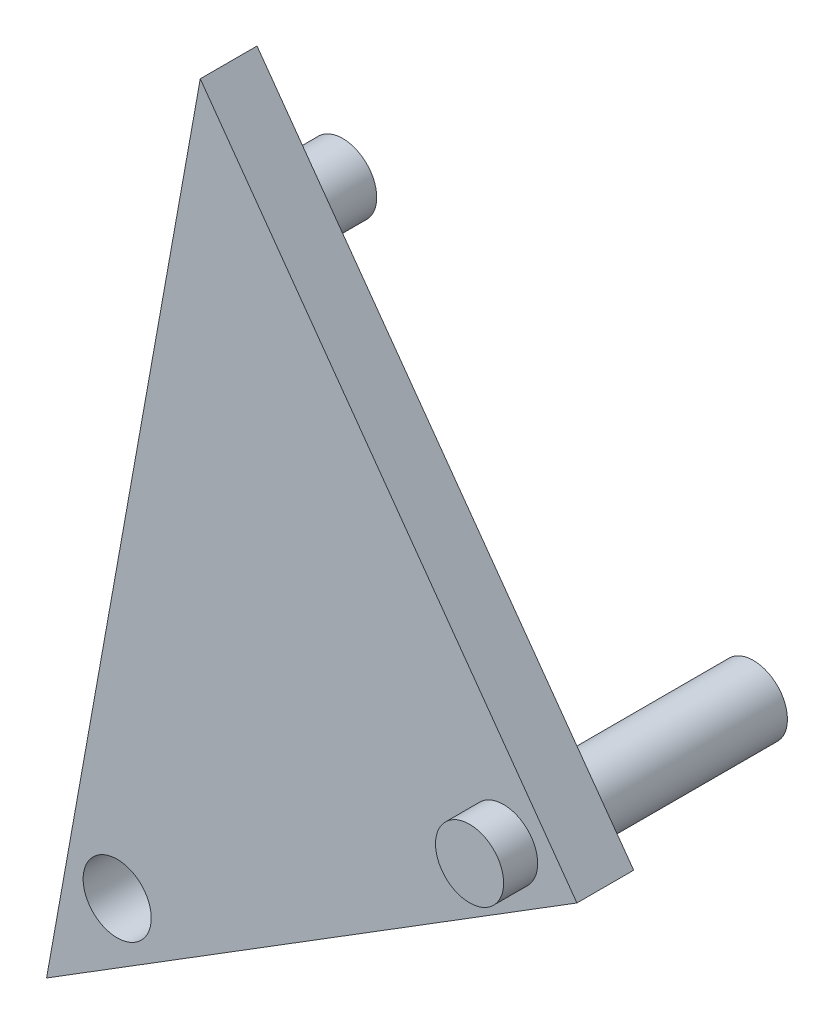
ISO-10303-21;
HEADER;
FILE_DESCRIPTION(('STEP AP214'),'2;1');
FILE_NAME('part.step','',(''),(''),'','','');
FILE_SCHEMA(('AUTOMOTIVE_DESIGN { 1 0 10303 214 1 1 1 1 }'));
ENDSEC;
DATA;
#1=APPLICATION_CONTEXT('core data for automotive mechanical design processes');
#2=APPLICATION_PROTOCOL_DEFINITION('international standard','automotive_design',2000,#1);
#3=PRODUCT_CONTEXT('',#1,'mechanical');
#4=PRODUCT('Part','Part','',(#3));
#5=PRODUCT_RELATED_PRODUCT_CATEGORY('part','',(#4));
#6=PRODUCT_DEFINITION_FORMATION('','',#4);
#7=PRODUCT_DEFINITION_CONTEXT('part definition',#1,'design');
#8=PRODUCT_DEFINITION('design','',#6,#7);
#9=PRODUCT_DEFINITION_SHAPE('','',#8);
#10=(LENGTH_UNIT() NAMED_UNIT(*) SI_UNIT(.MILLI.,.METRE.));
#11=(NAMED_UNIT(*) PLANE_ANGLE_UNIT() SI_UNIT($,.RADIAN.));
#12=(NAMED_UNIT(*) SI_UNIT($,.STERADIAN.) SOLID_ANGLE_UNIT());
#13=UNCERTAINTY_MEASURE_WITH_UNIT(LENGTH_MEASURE(1.E-05),#10,'distance_accuracy_value','');
#14=(GEOMETRIC_REPRESENTATION_CONTEXT(3) GLOBAL_UNCERTAINTY_ASSIGNED_CONTEXT((#13)) GLOBAL_UNIT_ASSIGNED_CONTEXT((#10,
#11,#12)) REPRESENTATION_CONTEXT('',''));
#15=CARTESIAN_POINT('',(0.,0.,0.));
#16=DIRECTION('',(0.,0.,1.));
#17=DIRECTION('',(1.,0.,0.));
#18=AXIS2_PLACEMENT_3D('',#15,#16,#17);
#19=CARTESIAN_POINT('',(0.,0.,5.));
#20=DIRECTION('',(0.,0.,-1.));
#21=DIRECTION('',(-1.,0.,0.));
#22=AXIS2_PLACEMENT_3D('',#19,#20,#21);
#23=PLANE('',#22);
#24=CARTESIAN_POINT('',(0.,0.,5.));
#25=DIRECTION('',(0.,0.,-1.));
#26=DIRECTION('',(-1.,0.,0.));
#27=AXIS2_PLACEMENT_3D('',#24,#25,#26);
#28=CIRCLE('',#27,3.);
#29=CARTESIAN_POINT('',(-3.,0.,5.));
#30=VERTEX_POINT('',#29);
#31=EDGE_CURVE('E11',#30,#30,#28,.F.);
#32=ORIENTED_EDGE('',*,*,#31,.F.);
#33=EDGE_LOOP('',(#32));
#34=FACE_BOUND('',#33,.T.);
#35=DIRECTION('',(-0.582602056564009,0.812757555293943,0.));
#36=VECTOR('',#35,1.);
#37=CARTESIAN_POINT('',(6.45568328839875,-1.28201635887784,5.));
#38=LINE('',#37,#36);
#39=CARTESIAN_POINT('',(6.45568328839875,-1.28201635887784,5.));
#40=VERTEX_POINT('',#39);
#41=CARTESIAN_POINT('',(-26.7245022929149,45.0059193142518,5.));
#42=VERTEX_POINT('',#41);
#43=EDGE_CURVE('E75',#40,#42,#38,.T.);
#44=ORIENTED_EDGE('',*,*,#43,.T.);
#45=DIRECTION('',(-0.176792332926242,-0.984248175522056,0.));
#46=VECTOR('',#45,1.);
#47=CARTESIAN_POINT('',(-26.7245022929149,45.0059193142518,5.));
#48=LINE('',#47,#46);
#49=CARTESIAN_POINT('',(-40.2625589217451,-30.3639076261477,5.));
#50=VERTEX_POINT('',#49);
#51=EDGE_CURVE('E70',#42,#50,#48,.T.);
#52=ORIENTED_EDGE('',*,*,#51,.T.);
#53=DIRECTION('',(0.848952556725454,0.528469068564391,0.));
#54=VECTOR('',#53,1.);
#55=CARTESIAN_POINT('',(-40.2625589217451,-30.3639076261477,5.));
#56=LINE('',#55,#54);
#57=EDGE_CURVE('E49',#50,#40,#56,.T.);
#58=ORIENTED_EDGE('',*,*,#57,.T.);
#59=EDGE_LOOP('',(#44,#52,#58));
#60=FACE_BOUND('',#59,.T.);
#61=CARTESIAN_POINT('',(-34.0429975246907,-21.1916096494321,5.));
#62=DIRECTION('',(0.,0.,1.));
#63=DIRECTION('',(1.,0.,0.));
#64=AXIS2_PLACEMENT_3D('',#61,#62,#63);
#65=CIRCLE('',#64,3.);
#66=CARTESIAN_POINT('',(-31.0429975246907,-21.1916096494321,5.));
#67=VERTEX_POINT('',#66);
#68=EDGE_CURVE('E90',#67,#67,#65,.T.);
#69=ORIENTED_EDGE('',*,*,#68,.F.);
#70=EDGE_LOOP('',(#69));
#71=FACE_BOUND('',#70,.T.);
#72=ADVANCED_FACE('F32',(#34,#60,#71),#23,.F.);
#73=CARTESIAN_POINT('',(0.,0.,0.));
#74=DIRECTION('',(0.,0.,-1.));
#75=DIRECTION('',(-1.,0.,0.));
#76=AXIS2_PLACEMENT_3D('',#73,#74,#75);
#77=PLANE('',#76);
#78=CARTESIAN_POINT('',(0.,0.,0.));
#79=DIRECTION('',(0.,0.,-1.));
#80=DIRECTION('',(-1.,0.,0.));
#81=AXIS2_PLACEMENT_3D('',#78,#79,#80);
#82=CIRCLE('',#81,3.);
#83=CARTESIAN_POINT('',(-3.,0.,0.));
#84=VERTEX_POINT('',#83);
#85=EDGE_CURVE('E103',#84,#84,#82,.T.);
#86=ORIENTED_EDGE('',*,*,#85,.F.);
#87=EDGE_LOOP('',(#86));
#88=FACE_BOUND('',#87,.T.);
#89=DIRECTION('',(-0.582602056564009,0.812757555293943,0.));
#90=VECTOR('',#89,1.);
#91=CARTESIAN_POINT('',(6.45568328839875,-1.28201635887784,0.));
#92=LINE('',#91,#90);
#93=CARTESIAN_POINT('',(6.45568328839875,-1.28201635887784,0.));
#94=VERTEX_POINT('',#93);
#95=CARTESIAN_POINT('',(-26.7245022929149,45.0059193142518,0.));
#96=VERTEX_POINT('',#95);
#97=EDGE_CURVE('E82',#94,#96,#92,.T.);
#98=ORIENTED_EDGE('',*,*,#97,.F.);
#99=DIRECTION('',(0.848952556725454,0.528469068564391,0.));
#100=VECTOR('',#99,1.);
#101=CARTESIAN_POINT('',(-40.2625589217451,-30.3639076261477,0.));
#102=LINE('',#101,#100);
#103=CARTESIAN_POINT('',(-40.2625589217451,-30.3639076261477,0.));
#104=VERTEX_POINT('',#103);
#105=EDGE_CURVE('E67',#104,#94,#102,.T.);
#106=ORIENTED_EDGE('',*,*,#105,.F.);
#107=DIRECTION('',(-0.176792332926242,-0.984248175522056,0.));
#108=VECTOR('',#107,1.);
#109=CARTESIAN_POINT('',(-26.7245022929149,45.0059193142518,0.));
#110=LINE('',#109,#108);
#111=EDGE_CURVE('E62',#96,#104,#110,.T.);
#112=ORIENTED_EDGE('',*,*,#111,.F.);
#113=EDGE_LOOP('',(#98,#106,#112));
#114=FACE_BOUND('',#113,.T.);
#115=CARTESIAN_POINT('',(-24.1779853474064,33.7294385446986,0.));
#116=DIRECTION('',(0.,0.,-1.));
#117=DIRECTION('',(-1.,0.,0.));
#118=AXIS2_PLACEMENT_3D('',#115,#116,#117);
#119=CIRCLE('',#118,3.);
#120=CARTESIAN_POINT('',(-27.1779853474064,33.7294385446986,0.));
#121=VERTEX_POINT('',#120);
#122=EDGE_CURVE('E95',#121,#121,#119,.T.);
#123=ORIENTED_EDGE('',*,*,#122,.F.);
#124=EDGE_LOOP('',(#123));
#125=FACE_BOUND('',#124,.T.);
#126=CARTESIAN_POINT('',(-34.0429975246907,-21.1916096494321,0.));
#127=DIRECTION('',(0.,0.,1.));
#128=DIRECTION('',(1.,0.,0.));
#129=AXIS2_PLACEMENT_3D('',#126,#127,#128);
#130=CIRCLE('',#129,3.);
#131=CARTESIAN_POINT('',(-31.0429975246907,-21.1916096494321,0.));
#132=VERTEX_POINT('',#131);
#133=EDGE_CURVE('E92',#132,#132,#130,.T.);
#134=ORIENTED_EDGE('',*,*,#133,.T.);
#135=EDGE_LOOP('',(#134));
#136=FACE_BOUND('',#135,.T.);
#137=ADVANCED_FACE('F123',(#88,#114,#125,#136),#77,.T.);
#138=CARTESIAN_POINT('',(6.45568328839875,-1.28201635887784,5.));
#139=DIRECTION('',(-0.812757555293943,-0.582602056564009,0.));
#140=DIRECTION('',(0.582602056564009,-0.812757555293943,0.));
#141=AXIS2_PLACEMENT_3D('',#138,#139,#140);
#142=PLANE('',#141);
#143=ORIENTED_EDGE('',*,*,#97,.T.);
#144=DIRECTION('',(0.,0.,-1.));
#145=VECTOR('',#144,1.);
#146=CARTESIAN_POINT('',(-26.7245022929149,45.0059193142518,5.));
#147=LINE('',#146,#145);
#148=EDGE_CURVE('E41',#42,#96,#147,.T.);
#149=ORIENTED_EDGE('',*,*,#148,.F.);
#150=ORIENTED_EDGE('',*,*,#43,.F.);
#151=DIRECTION('',(0.,0.,-1.));
#152=VECTOR('',#151,1.);
#153=CARTESIAN_POINT('',(6.45568328839875,-1.28201635887784,5.));
#154=LINE('',#153,#152);
#155=EDGE_CURVE('E83',#40,#94,#154,.T.);
#156=ORIENTED_EDGE('',*,*,#155,.T.);
#157=EDGE_LOOP('',(#143,#149,#150,#156));
#158=FACE_BOUND('',#157,.T.);
#159=ADVANCED_FACE('F34',(#158),#142,.F.);
#160=CARTESIAN_POINT('',(-26.7245022929149,45.0059193142518,5.));
#161=DIRECTION('',(0.984248175522056,-0.176792332926242,0.));
#162=DIRECTION('',(0.176792332926242,0.984248175522056,0.));
#163=AXIS2_PLACEMENT_3D('',#160,#161,#162);
#164=PLANE('',#163);
#165=ORIENTED_EDGE('',*,*,#111,.T.);
#166=DIRECTION('',(0.,0.,-1.));
#167=VECTOR('',#166,1.);
#168=CARTESIAN_POINT('',(-40.2625589217451,-30.3639076261477,5.));
#169=LINE('',#168,#167);
#170=EDGE_CURVE('E74',#50,#104,#169,.T.);
#171=ORIENTED_EDGE('',*,*,#170,.F.);
#172=ORIENTED_EDGE('',*,*,#51,.F.);
#173=ORIENTED_EDGE('',*,*,#148,.T.);
#174=EDGE_LOOP('',(#165,#171,#172,#173));
#175=FACE_BOUND('',#174,.T.);
#176=ADVANCED_FACE('F71',(#175),#164,.F.);
#177=CARTESIAN_POINT('',(-40.2625589217451,-30.3639076261477,5.));
#178=DIRECTION('',(-0.528469068564391,0.848952556725454,0.));
#179=DIRECTION('',(-0.848952556725454,-0.528469068564391,0.));
#180=AXIS2_PLACEMENT_3D('',#177,#178,#179);
#181=PLANE('',#180);
#182=ORIENTED_EDGE('',*,*,#105,.T.);
#183=ORIENTED_EDGE('',*,*,#155,.F.);
#184=ORIENTED_EDGE('',*,*,#57,.F.);
#185=ORIENTED_EDGE('',*,*,#170,.T.);
#186=EDGE_LOOP('',(#182,#183,#184,#185));
#187=FACE_BOUND('',#186,.T.);
#188=ADVANCED_FACE('F134',(#187),#181,.F.);
#189=CARTESIAN_POINT('',(-34.0429975246907,-21.1916096494321,5.));
#190=DIRECTION('',(0.,0.,-1.));
#191=DIRECTION('',(-1.,0.,0.));
#192=AXIS2_PLACEMENT_3D('',#189,#190,#191);
#193=CYLINDRICAL_SURFACE('',#192,3.);
#194=ORIENTED_EDGE('',*,*,#68,.T.);
#195=EDGE_LOOP('',(#194));
#196=FACE_BOUND('',#195,.T.);
#197=ORIENTED_EDGE('',*,*,#133,.F.);
#198=EDGE_LOOP('',(#197));
#199=FACE_BOUND('',#198,.T.);
#200=ADVANCED_FACE('F131',(#196,#199),#193,.F.);
#201=CARTESIAN_POINT('',(-24.1779853474064,33.7294385446986,-5.));
#202=DIRECTION('',(0.,0.,1.));
#203=DIRECTION('',(1.,0.,0.));
#204=AXIS2_PLACEMENT_3D('',#201,#202,#203);
#205=CYLINDRICAL_SURFACE('',#204,3.);
#206=ORIENTED_EDGE('',*,*,#122,.T.);
#207=EDGE_LOOP('',(#206));
#208=FACE_BOUND('',#207,.T.);
#209=CARTESIAN_POINT('',(-24.1779853474064,33.7294385446986,-5.));
#210=DIRECTION('',(0.,0.,1.));
#211=DIRECTION('',(1.,0.,0.));
#212=AXIS2_PLACEMENT_3D('',#209,#210,#211);
#213=CIRCLE('',#212,3.);
#214=CARTESIAN_POINT('',(-21.1779853474064,33.7294385446986,-5.));
#215=VERTEX_POINT('',#214);
#216=EDGE_CURVE('E100',#215,#215,#213,.T.);
#217=ORIENTED_EDGE('',*,*,#216,.T.);
#218=EDGE_LOOP('',(#217));
#219=FACE_BOUND('',#218,.T.);
#220=ADVANCED_FACE('F170',(#208,#219),#205,.T.);
#221=CARTESIAN_POINT('',(-24.1779853474064,33.7294385446986,-5.));
#222=DIRECTION('',(0.,0.,1.));
#223=DIRECTION('',(1.,0.,0.));
#224=AXIS2_PLACEMENT_3D('',#221,#222,#223);
#225=PLANE('',#224);
#226=ORIENTED_EDGE('',*,*,#216,.F.);
#227=EDGE_LOOP('',(#226));
#228=FACE_BOUND('',#227,.T.);
#229=ADVANCED_FACE('F185',(#228),#225,.F.);
#230=CARTESIAN_POINT('',(0.,0.,-17.));
#231=DIRECTION('',(0.,0.,1.));
#232=DIRECTION('',(1.,0.,0.));
#233=AXIS2_PLACEMENT_3D('',#230,#231,#232);
#234=CYLINDRICAL_SURFACE('',#233,3.);
#235=ORIENTED_EDGE('',*,*,#85,.T.);
#236=EDGE_LOOP('',(#235));
#237=FACE_BOUND('',#236,.T.);
#238=CARTESIAN_POINT('',(0.,0.,-17.));
#239=DIRECTION('',(0.,0.,1.));
#240=DIRECTION('',(1.,0.,0.));
#241=AXIS2_PLACEMENT_3D('',#238,#239,#240);
#242=CIRCLE('',#241,3.);
#243=CARTESIAN_POINT('',(3.,0.,-17.));
#244=VERTEX_POINT('',#243);
#245=EDGE_CURVE('E106',#244,#244,#242,.T.);
#246=ORIENTED_EDGE('',*,*,#245,.T.);
#247=EDGE_LOOP('',(#246));
#248=FACE_BOUND('',#247,.T.);
#249=ADVANCED_FACE('F192',(#237,#248),#234,.T.);
#250=CARTESIAN_POINT('',(0.,0.,-17.));
#251=DIRECTION('',(0.,0.,1.));
#252=DIRECTION('',(1.,0.,0.));
#253=AXIS2_PLACEMENT_3D('',#250,#251,#252);
#254=PLANE('',#253);
#255=ORIENTED_EDGE('',*,*,#245,.F.);
#256=EDGE_LOOP('',(#255));
#257=FACE_BOUND('',#256,.T.);
#258=ADVANCED_FACE('F118',(#257),#254,.F.);
#259=CARTESIAN_POINT('',(0.,0.,8.));
#260=DIRECTION('',(0.,0.,-1.));
#261=DIRECTION('',(-1.,0.,0.));
#262=AXIS2_PLACEMENT_3D('',#259,#260,#261);
#263=CYLINDRICAL_SURFACE('',#262,3.);
#264=CARTESIAN_POINT('',(0.,0.,8.));
#265=DIRECTION('',(0.,0.,1.));
#266=DIRECTION('',(1.,0.,0.));
#267=AXIS2_PLACEMENT_3D('',#264,#265,#266);
#268=CIRCLE('',#267,3.);
#269=CARTESIAN_POINT('',(3.,0.,8.));
#270=VERTEX_POINT('',#269);
#271=EDGE_CURVE('E109',#270,#270,#268,.T.);
#272=ORIENTED_EDGE('',*,*,#271,.F.);
#273=EDGE_LOOP('',(#272));
#274=FACE_BOUND('',#273,.T.);
#275=ORIENTED_EDGE('',*,*,#31,.T.);
#276=EDGE_LOOP('',(#275));
#277=FACE_BOUND('',#276,.T.);
#278=ADVANCED_FACE('F115',(#274,#277),#263,.T.);
#279=CARTESIAN_POINT('',(0.,0.,8.));
#280=DIRECTION('',(0.,0.,1.));
#281=DIRECTION('',(1.,0.,0.));
#282=AXIS2_PLACEMENT_3D('',#279,#280,#281);
#283=PLANE('',#282);
#284=ORIENTED_EDGE('',*,*,#271,.T.);
#285=EDGE_LOOP('',(#284));
#286=FACE_BOUND('',#285,.T.);
#287=ADVANCED_FACE('F113',(#286),#283,.T.);
#288=CLOSED_SHELL('',(#72,#137,#159,#176,#188,#200,#220,#229,#249,#258,#278,#287));
#289=MANIFOLD_SOLID_BREP('B2',#288);
#290=ADVANCED_BREP_SHAPE_REPRESENTATION('',(#18,#289),#14);
#291=SHAPE_DEFINITION_REPRESENTATION(#9,#290);
ENDSEC;
END-ISO-10303-21;
